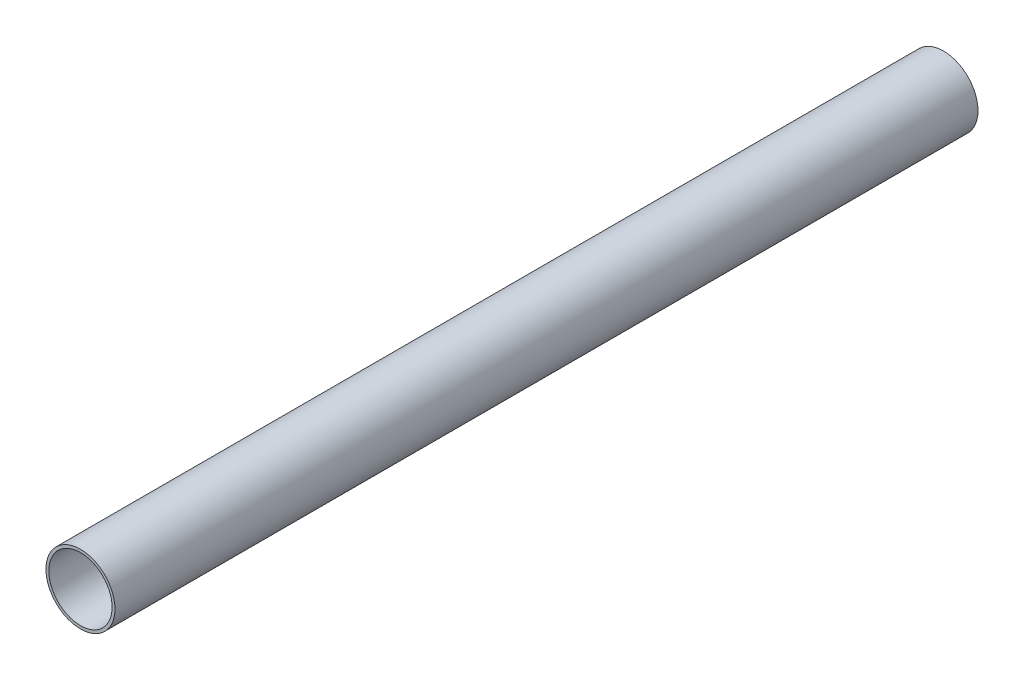
ISO-10303-21;
HEADER;
FILE_DESCRIPTION(('STEP AP214'),'2;1');
FILE_NAME('part.step','',(''),(''),'','','');
FILE_SCHEMA(('AUTOMOTIVE_DESIGN { 1 0 10303 214 1 1 1 1 }'));
ENDSEC;
DATA;
#1=APPLICATION_CONTEXT('core data for automotive mechanical design processes');
#2=APPLICATION_PROTOCOL_DEFINITION('international standard','automotive_design',2000,#1);
#3=PRODUCT_CONTEXT('',#1,'mechanical');
#4=PRODUCT('Part','Part','',(#3));
#5=PRODUCT_RELATED_PRODUCT_CATEGORY('part','',(#4));
#6=PRODUCT_DEFINITION_FORMATION('','',#4);
#7=PRODUCT_DEFINITION_CONTEXT('part definition',#1,'design');
#8=PRODUCT_DEFINITION('design','',#6,#7);
#9=PRODUCT_DEFINITION_SHAPE('','',#8);
#10=(LENGTH_UNIT() NAMED_UNIT(*) SI_UNIT(.MILLI.,.METRE.));
#11=(NAMED_UNIT(*) PLANE_ANGLE_UNIT() SI_UNIT($,.RADIAN.));
#12=(NAMED_UNIT(*) SI_UNIT($,.STERADIAN.) SOLID_ANGLE_UNIT());
#13=UNCERTAINTY_MEASURE_WITH_UNIT(LENGTH_MEASURE(1.E-05),#10,'distance_accuracy_value','');
#14=(GEOMETRIC_REPRESENTATION_CONTEXT(3) GLOBAL_UNCERTAINTY_ASSIGNED_CONTEXT((#13)) GLOBAL_UNIT_ASSIGNED_CONTEXT((#10,
#11,#12)) REPRESENTATION_CONTEXT('',''));
#15=CARTESIAN_POINT('',(0.,0.,0.));
#16=DIRECTION('',(0.,0.,1.));
#17=DIRECTION('',(1.,0.,0.));
#18=AXIS2_PLACEMENT_3D('',#15,#16,#17);
#19=CARTESIAN_POINT('',(0.,0.,75.));
#20=DIRECTION('',(0.,0.,-1.));
#21=DIRECTION('',(-1.,0.,0.));
#22=AXIS2_PLACEMENT_3D('',#19,#20,#21);
#23=CYLINDRICAL_SURFACE('',#22,3.);
#24=CARTESIAN_POINT('',(0.,0.,75.));
#25=DIRECTION('',(0.,0.,1.));
#26=DIRECTION('',(1.,0.,0.));
#27=AXIS2_PLACEMENT_3D('',#24,#25,#26);
#28=CIRCLE('',#27,3.);
#29=CARTESIAN_POINT('',(3.,0.,75.));
#30=VERTEX_POINT('',#29);
#31=EDGE_CURVE('E10',#30,#30,#28,.T.);
#32=ORIENTED_EDGE('',*,*,#31,.F.);
#33=EDGE_LOOP('',(#32));
#34=FACE_BOUND('',#33,.T.);
#35=CARTESIAN_POINT('',(0.,0.,0.));
#36=DIRECTION('',(0.,0.,1.));
#37=DIRECTION('',(1.,0.,0.));
#38=AXIS2_PLACEMENT_3D('',#35,#36,#37);
#39=CIRCLE('',#38,3.);
#40=CARTESIAN_POINT('',(3.,0.,0.));
#41=VERTEX_POINT('',#40);
#42=EDGE_CURVE('E35',#41,#41,#39,.T.);
#43=ORIENTED_EDGE('',*,*,#42,.T.);
#44=EDGE_LOOP('',(#43));
#45=FACE_BOUND('',#44,.T.);
#46=ADVANCED_FACE('F32',(#34,#45),#23,.T.);
#47=CARTESIAN_POINT('',(0.,0.,75.));
#48=DIRECTION('',(0.,0.,1.));
#49=DIRECTION('',(1.,0.,0.));
#50=AXIS2_PLACEMENT_3D('',#47,#48,#49);
#51=PLANE('',#50);
#52=CARTESIAN_POINT('',(0.,0.,75.));
#53=DIRECTION('',(0.,0.,-1.));
#54=DIRECTION('',(-1.,0.,0.));
#55=AXIS2_PLACEMENT_3D('',#52,#53,#54);
#56=CIRCLE('',#55,2.75);
#57=CARTESIAN_POINT('',(-2.75,0.,75.));
#58=VERTEX_POINT('',#57);
#59=EDGE_CURVE('E42',#58,#58,#56,.T.);
#60=ORIENTED_EDGE('',*,*,#59,.T.);
#61=EDGE_LOOP('',(#60));
#62=FACE_BOUND('',#61,.T.);
#63=ORIENTED_EDGE('',*,*,#31,.T.);
#64=EDGE_LOOP('',(#63));
#65=FACE_BOUND('',#64,.T.);
#66=ADVANCED_FACE('F50',(#62,#65),#51,.T.);
#67=CARTESIAN_POINT('',(0.,0.,0.));
#68=DIRECTION('',(0.,0.,1.));
#69=DIRECTION('',(1.,0.,0.));
#70=AXIS2_PLACEMENT_3D('',#67,#68,#69);
#71=PLANE('',#70);
#72=CARTESIAN_POINT('',(0.,0.,0.));
#73=DIRECTION('',(0.,0.,-1.));
#74=DIRECTION('',(-1.,0.,0.));
#75=AXIS2_PLACEMENT_3D('',#72,#73,#74);
#76=CIRCLE('',#75,2.75);
#77=CARTESIAN_POINT('',(-2.75,0.,0.));
#78=VERTEX_POINT('',#77);
#79=EDGE_CURVE('E44',#78,#78,#76,.T.);
#80=ORIENTED_EDGE('',*,*,#79,.F.);
#81=EDGE_LOOP('',(#80));
#82=FACE_BOUND('',#81,.T.);
#83=ORIENTED_EDGE('',*,*,#42,.F.);
#84=EDGE_LOOP('',(#83));
#85=FACE_BOUND('',#84,.T.);
#86=ADVANCED_FACE('F55',(#82,#85),#71,.F.);
#87=CARTESIAN_POINT('',(0.,0.,75.));
#88=DIRECTION('',(0.,0.,-1.));
#89=DIRECTION('',(-1.,0.,0.));
#90=AXIS2_PLACEMENT_3D('',#87,#88,#89);
#91=CYLINDRICAL_SURFACE('',#90,2.75);
#92=ORIENTED_EDGE('',*,*,#59,.F.);
#93=EDGE_LOOP('',(#92));
#94=FACE_BOUND('',#93,.T.);
#95=ORIENTED_EDGE('',*,*,#79,.T.);
#96=EDGE_LOOP('',(#95));
#97=FACE_BOUND('',#96,.T.);
#98=ADVANCED_FACE('F52',(#94,#97),#91,.F.);
#99=CLOSED_SHELL('',(#46,#66,#86,#98));
#100=MANIFOLD_SOLID_BREP('B2',#99);
#101=ADVANCED_BREP_SHAPE_REPRESENTATION('',(#18,#100),#14);
#102=SHAPE_DEFINITION_REPRESENTATION(#9,#101);
ENDSEC;
END-ISO-10303-21;
